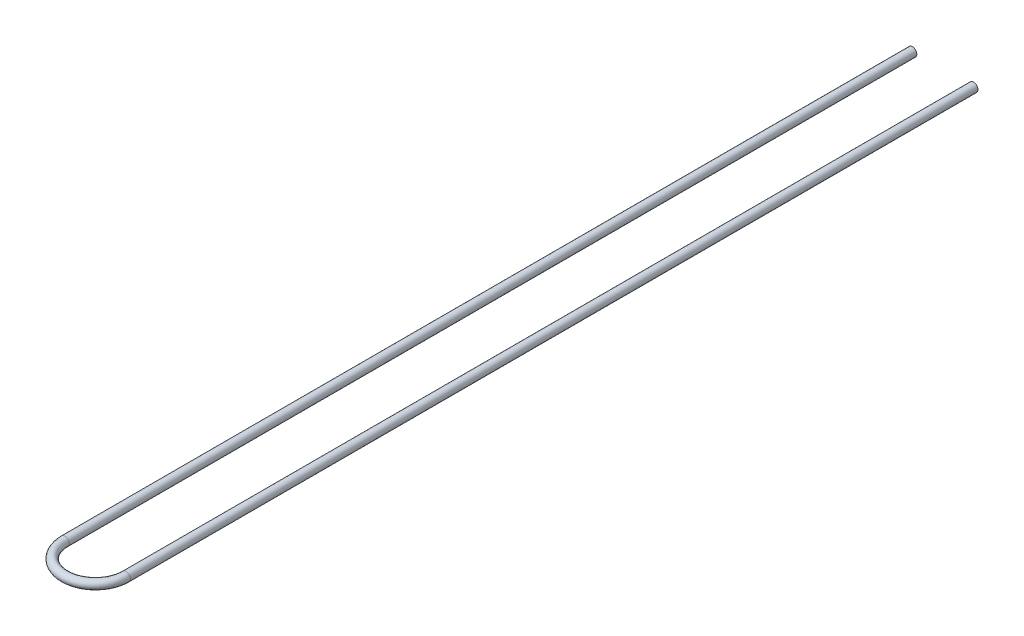
ISO-10303-21;
HEADER;
FILE_DESCRIPTION(('STEP AP214'),'2;1');
FILE_NAME('part.step','',(''),(''),'','','');
FILE_SCHEMA(('AUTOMOTIVE_DESIGN { 1 0 10303 214 1 1 1 1 }'));
ENDSEC;
DATA;
#1=APPLICATION_CONTEXT('core data for automotive mechanical design processes');
#2=APPLICATION_PROTOCOL_DEFINITION('international standard','automotive_design',2000,#1);
#3=PRODUCT_CONTEXT('',#1,'mechanical');
#4=PRODUCT('Part','Part','',(#3));
#5=PRODUCT_RELATED_PRODUCT_CATEGORY('part','',(#4));
#6=PRODUCT_DEFINITION_FORMATION('','',#4);
#7=PRODUCT_DEFINITION_CONTEXT('part definition',#1,'design');
#8=PRODUCT_DEFINITION('design','',#6,#7);
#9=PRODUCT_DEFINITION_SHAPE('','',#8);
#10=(LENGTH_UNIT() NAMED_UNIT(*) SI_UNIT(.MILLI.,.METRE.));
#11=(NAMED_UNIT(*) PLANE_ANGLE_UNIT() SI_UNIT($,.RADIAN.));
#12=(NAMED_UNIT(*) SI_UNIT($,.STERADIAN.) SOLID_ANGLE_UNIT());
#13=UNCERTAINTY_MEASURE_WITH_UNIT(LENGTH_MEASURE(1.E-05),#10,'distance_accuracy_value','');
#14=(GEOMETRIC_REPRESENTATION_CONTEXT(3) GLOBAL_UNCERTAINTY_ASSIGNED_CONTEXT((#13)) GLOBAL_UNIT_ASSIGNED_CONTEXT((#10,
#11,#12)) REPRESENTATION_CONTEXT('',''));
#15=CARTESIAN_POINT('',(0.,0.,0.));
#16=DIRECTION('',(0.,0.,1.));
#17=DIRECTION('',(1.,0.,0.));
#18=AXIS2_PLACEMENT_3D('',#15,#16,#17);
#19=CARTESIAN_POINT('',(-40.,0.,299.999999999999));
#20=DIRECTION('',(0.,0.,1.));
#21=DIRECTION('',(1.,0.,0.));
#22=AXIS2_PLACEMENT_3D('',#19,#20,#21);
#23=CYLINDRICAL_SURFACE('',#22,11.1);
#24=CARTESIAN_POINT('',(-39.9999999999997,0.,2440.));
#25=DIRECTION('',(0.,0.,1.));
#26=DIRECTION('',(1.,0.,0.));
#27=AXIS2_PLACEMENT_3D('',#24,#25,#26);
#28=CIRCLE('',#27,11.1);
#29=CARTESIAN_POINT('',(-51.0999999999997,0.,2440.));
#30=VERTEX_POINT('',#29);
#31=EDGE_CURVE('E54',#30,#30,#28,.T.);
#32=ORIENTED_EDGE('',*,*,#31,.F.);
#33=EDGE_LOOP('',(#32));
#34=FACE_BOUND('',#33,.T.);
#35=CARTESIAN_POINT('',(-40.,0.,299.999999999999));
#36=DIRECTION('',(0.,0.,1.));
#37=DIRECTION('',(1.,0.,0.));
#38=AXIS2_PLACEMENT_3D('',#35,#36,#37);
#39=CIRCLE('',#38,11.1);
#40=CARTESIAN_POINT('',(-28.9,0.,299.999999999999));
#41=VERTEX_POINT('',#40);
#42=EDGE_CURVE('E52',#41,#41,#39,.T.);
#43=ORIENTED_EDGE('',*,*,#42,.T.);
#44=EDGE_LOOP('',(#43));
#45=FACE_BOUND('',#44,.T.);
#46=ADVANCED_FACE('F31',(#34,#45),#23,.T.);
#47=CARTESIAN_POINT('',(37.2300000000003,0.,2440.));
#48=DIRECTION('',(0.,1.,0.));
#49=DIRECTION('',(0.,0.,1.));
#50=AXIS2_PLACEMENT_3D('',#47,#48,#49);
#51=TOROIDAL_SURFACE('',#50,77.23,11.1);
#52=CARTESIAN_POINT('',(114.46,0.,2440.));
#53=DIRECTION('',(0.,0.,-1.));
#54=DIRECTION('',(-1.,0.,0.));
#55=AXIS2_PLACEMENT_3D('',#52,#53,#54);
#56=CIRCLE('',#55,11.1);
#57=CARTESIAN_POINT('',(125.56,0.,2440.));
#58=VERTEX_POINT('',#57);
#59=EDGE_CURVE('E35',#58,#58,#56,.T.);
#60=CARTESIAN_POINT('',(37.2300000000003,0.,2440.));
#61=DIRECTION('',(0.,1.,0.));
#62=DIRECTION('',(0.,0.,1.));
#63=AXIS2_PLACEMENT_3D('',#60,#61,#62);
#64=CIRCLE('',#63,88.33);
#65=EDGE_CURVE('',#30,#58,#64,.T.);
#66=ORIENTED_EDGE('',*,*,#31,.T.);
#67=ORIENTED_EDGE('',*,*,#59,.F.);
#68=ORIENTED_EDGE('',*,*,#65,.T.);
#69=ORIENTED_EDGE('',*,*,#65,.F.);
#70=EDGE_LOOP('',(#66,#68,#67,#69));
#71=FACE_BOUND('',#70,.T.);
#72=ADVANCED_FACE('F62',(#71),#51,.T.);
#73=CARTESIAN_POINT('',(114.46,0.,2440.));
#74=DIRECTION('',(0.,0.,-1.));
#75=DIRECTION('',(-1.,0.,0.));
#76=AXIS2_PLACEMENT_3D('',#73,#74,#75);
#77=CYLINDRICAL_SURFACE('',#76,11.1);
#78=CARTESIAN_POINT('',(114.46,0.,299.999999999999));
#79=DIRECTION('',(0.,0.,-1.));
#80=DIRECTION('',(-1.,0.,0.));
#81=AXIS2_PLACEMENT_3D('',#78,#79,#80);
#82=CIRCLE('',#81,11.1);
#83=CARTESIAN_POINT('',(103.36,0.,299.999999999999));
#84=VERTEX_POINT('',#83);
#85=EDGE_CURVE('E48',#84,#84,#82,.T.);
#86=ORIENTED_EDGE('',*,*,#85,.F.);
#87=EDGE_LOOP('',(#86));
#88=FACE_BOUND('',#87,.T.);
#89=ORIENTED_EDGE('',*,*,#59,.T.);
#90=EDGE_LOOP('',(#89));
#91=FACE_BOUND('',#90,.T.);
#92=ADVANCED_FACE('F33',(#88,#91),#77,.T.);
#93=CARTESIAN_POINT('',(-40.,0.,299.999999999999));
#94=DIRECTION('',(0.,0.,1.));
#95=DIRECTION('',(1.,0.,0.));
#96=AXIS2_PLACEMENT_3D('',#93,#94,#95);
#97=PLANE('',#96);
#98=CARTESIAN_POINT('',(-40.,0.,299.999999999999));
#99=DIRECTION('',(0.,0.,1.));
#100=DIRECTION('',(1.,0.,0.));
#101=AXIS2_PLACEMENT_3D('',#98,#99,#100);
#102=CIRCLE('',#101,9.95);
#103=CARTESIAN_POINT('',(-30.05,0.,299.999999999999));
#104=VERTEX_POINT('',#103);
#105=EDGE_CURVE('E51',#104,#104,#102,.F.);
#106=ORIENTED_EDGE('',*,*,#105,.F.);
#107=EDGE_LOOP('',(#106));
#108=FACE_BOUND('',#107,.T.);
#109=ORIENTED_EDGE('',*,*,#42,.F.);
#110=EDGE_LOOP('',(#109));
#111=FACE_BOUND('',#110,.T.);
#112=ADVANCED_FACE('F68',(#108,#111),#97,.F.);
#113=CARTESIAN_POINT('',(114.46,0.,299.999999999999));
#114=DIRECTION('',(0.,0.,-1.));
#115=DIRECTION('',(-1.,0.,0.));
#116=AXIS2_PLACEMENT_3D('',#113,#114,#115);
#117=PLANE('',#116);
#118=CARTESIAN_POINT('',(114.46,0.,299.999999999999));
#119=DIRECTION('',(0.,0.,-1.));
#120=DIRECTION('',(-1.,0.,0.));
#121=AXIS2_PLACEMENT_3D('',#118,#119,#120);
#122=CIRCLE('',#121,9.95);
#123=CARTESIAN_POINT('',(104.51,0.,299.999999999999));
#124=VERTEX_POINT('',#123);
#125=EDGE_CURVE('E10',#124,#124,#122,.F.);
#126=ORIENTED_EDGE('',*,*,#125,.T.);
#127=EDGE_LOOP('',(#126));
#128=FACE_BOUND('',#127,.T.);
#129=ORIENTED_EDGE('',*,*,#85,.T.);
#130=EDGE_LOOP('',(#129));
#131=FACE_BOUND('',#130,.T.);
#132=ADVANCED_FACE('F86',(#128,#131),#117,.T.);
#133=CARTESIAN_POINT('',(-40.,0.,299.999999999999));
#134=DIRECTION('',(0.,0.,1.));
#135=DIRECTION('',(1.,0.,0.));
#136=AXIS2_PLACEMENT_3D('',#133,#134,#135);
#137=CYLINDRICAL_SURFACE('',#136,9.95);
#138=CARTESIAN_POINT('',(-39.9999999999997,0.,2440.));
#139=DIRECTION('',(0.,0.,1.));
#140=DIRECTION('',(1.,0.,0.));
#141=AXIS2_PLACEMENT_3D('',#138,#139,#140);
#142=CIRCLE('',#141,9.95);
#143=CARTESIAN_POINT('',(-49.9499999999997,0.,2440.));
#144=VERTEX_POINT('',#143);
#145=EDGE_CURVE('E44',#144,#144,#142,.F.);
#146=ORIENTED_EDGE('',*,*,#145,.F.);
#147=EDGE_LOOP('',(#146));
#148=FACE_BOUND('',#147,.T.);
#149=ORIENTED_EDGE('',*,*,#105,.T.);
#150=EDGE_LOOP('',(#149));
#151=FACE_BOUND('',#150,.T.);
#152=ADVANCED_FACE('F80',(#148,#151),#137,.F.);
#153=CARTESIAN_POINT('',(37.2300000000003,0.,2440.));
#154=DIRECTION('',(0.,1.,0.));
#155=DIRECTION('',(0.,0.,1.));
#156=AXIS2_PLACEMENT_3D('',#153,#154,#155);
#157=TOROIDAL_SURFACE('',#156,77.23,9.95);
#158=CARTESIAN_POINT('',(114.46,0.,2440.));
#159=DIRECTION('',(0.,0.,-1.));
#160=DIRECTION('',(-1.,0.,0.));
#161=AXIS2_PLACEMENT_3D('',#158,#159,#160);
#162=CIRCLE('',#161,9.95);
#163=CARTESIAN_POINT('',(124.41,0.,2440.));
#164=VERTEX_POINT('',#163);
#165=EDGE_CURVE('E39',#164,#164,#162,.F.);
#166=CARTESIAN_POINT('',(37.2300000000003,0.,2440.));
#167=DIRECTION('',(0.,1.,0.));
#168=DIRECTION('',(0.,0.,1.));
#169=AXIS2_PLACEMENT_3D('',#166,#167,#168);
#170=CIRCLE('',#169,87.18);
#171=EDGE_CURVE('',#144,#164,#170,.T.);
#172=ORIENTED_EDGE('',*,*,#145,.T.);
#173=ORIENTED_EDGE('',*,*,#165,.F.);
#174=ORIENTED_EDGE('',*,*,#171,.T.);
#175=ORIENTED_EDGE('',*,*,#171,.F.);
#176=EDGE_LOOP('',(#172,#174,#173,#175));
#177=FACE_BOUND('',#176,.T.);
#178=ADVANCED_FACE('F74',(#177),#157,.F.);
#179=CARTESIAN_POINT('',(114.46,0.,2440.));
#180=DIRECTION('',(0.,0.,-1.));
#181=DIRECTION('',(-1.,0.,0.));
#182=AXIS2_PLACEMENT_3D('',#179,#180,#181);
#183=CYLINDRICAL_SURFACE('',#182,9.95);
#184=ORIENTED_EDGE('',*,*,#125,.F.);
#185=EDGE_LOOP('',(#184));
#186=FACE_BOUND('',#185,.T.);
#187=ORIENTED_EDGE('',*,*,#165,.T.);
#188=EDGE_LOOP('',(#187));
#189=FACE_BOUND('',#188,.T.);
#190=ADVANCED_FACE('F72',(#186,#189),#183,.F.);
#191=CLOSED_SHELL('',(#46,#72,#92,#112,#132,#152,#178,#190));
#192=MANIFOLD_SOLID_BREP('B2',#191);
#193=ADVANCED_BREP_SHAPE_REPRESENTATION('',(#18,#192),#14);
#194=SHAPE_DEFINITION_REPRESENTATION(#9,#193);
ENDSEC;
END-ISO-10303-21;
